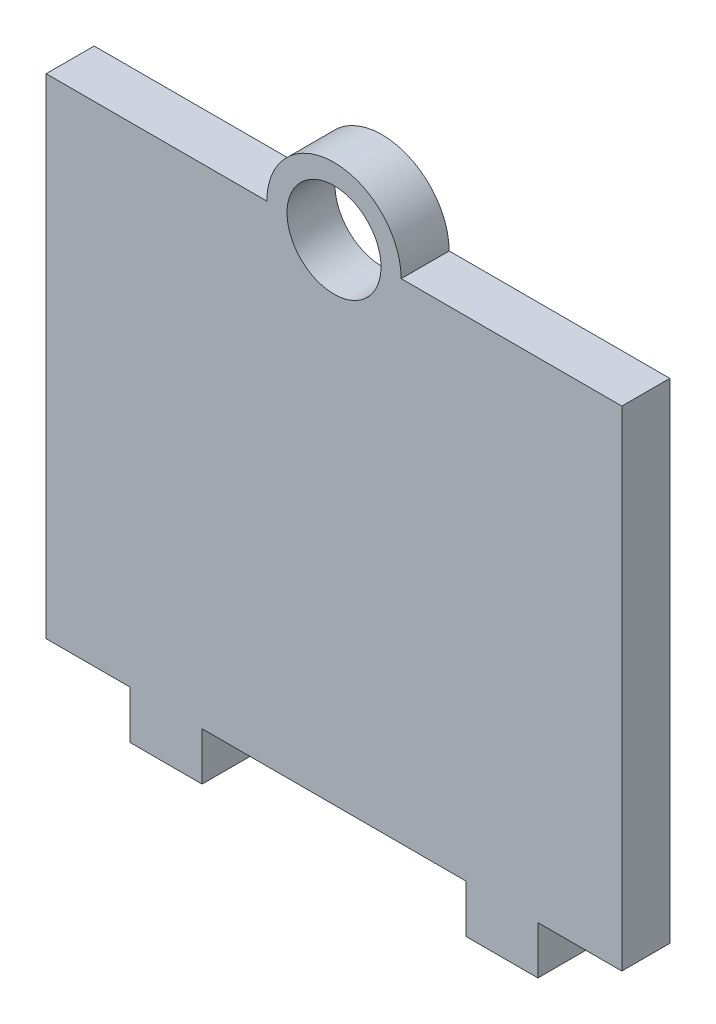
ISO-10303-21;
HEADER;
FILE_DESCRIPTION(('STEP AP214'),'2;1');
FILE_NAME('part.step','',(''),(''),'','','');
FILE_SCHEMA(('AUTOMOTIVE_DESIGN { 1 0 10303 214 1 1 1 1 }'));
ENDSEC;
DATA;
#1=APPLICATION_CONTEXT('core data for automotive mechanical design processes');
#2=APPLICATION_PROTOCOL_DEFINITION('international standard','automotive_design',2000,#1);
#3=PRODUCT_CONTEXT('',#1,'mechanical');
#4=PRODUCT('Part','Part','',(#3));
#5=PRODUCT_RELATED_PRODUCT_CATEGORY('part','',(#4));
#6=PRODUCT_DEFINITION_FORMATION('','',#4);
#7=PRODUCT_DEFINITION_CONTEXT('part definition',#1,'design');
#8=PRODUCT_DEFINITION('design','',#6,#7);
#9=PRODUCT_DEFINITION_SHAPE('','',#8);
#10=(LENGTH_UNIT() NAMED_UNIT(*) SI_UNIT(.MILLI.,.METRE.));
#11=(NAMED_UNIT(*) PLANE_ANGLE_UNIT() SI_UNIT($,.RADIAN.));
#12=(NAMED_UNIT(*) SI_UNIT($,.STERADIAN.) SOLID_ANGLE_UNIT());
#13=UNCERTAINTY_MEASURE_WITH_UNIT(LENGTH_MEASURE(1.E-05),#10,'distance_accuracy_value','');
#14=(GEOMETRIC_REPRESENTATION_CONTEXT(3) GLOBAL_UNCERTAINTY_ASSIGNED_CONTEXT((#13)) GLOBAL_UNIT_ASSIGNED_CONTEXT((#10,
#11,#12)) REPRESENTATION_CONTEXT('',''));
#15=CARTESIAN_POINT('',(0.,0.,0.));
#16=DIRECTION('',(0.,0.,1.));
#17=DIRECTION('',(1.,0.,0.));
#18=AXIS2_PLACEMENT_3D('',#15,#16,#17);
#19=CARTESIAN_POINT('',(-76.2,142.24,-12.7));
#20=DIRECTION('',(-1.,0.,0.));
#21=DIRECTION('',(0.,0.,1.));
#22=AXIS2_PLACEMENT_3D('',#19,#20,#21);
#23=PLANE('',#22);
#24=DIRECTION('',(0.,-1.,0.));
#25=VECTOR('',#24,1.);
#26=CARTESIAN_POINT('',(-76.2,142.24,0.));
#27=LINE('',#26,#25);
#28=CARTESIAN_POINT('',(-76.2,142.24,0.));
#29=VERTEX_POINT('',#28);
#30=CARTESIAN_POINT('',(-76.2,12.7,0.));
#31=VERTEX_POINT('',#30);
#32=EDGE_CURVE('E164',#29,#31,#27,.T.);
#33=ORIENTED_EDGE('',*,*,#32,.F.);
#34=DIRECTION('',(0.,0.,1.));
#35=VECTOR('',#34,1.);
#36=CARTESIAN_POINT('',(-76.2,142.24,-12.7));
#37=LINE('',#36,#35);
#38=CARTESIAN_POINT('',(-76.2,142.24,-12.7));
#39=VERTEX_POINT('',#38);
#40=EDGE_CURVE('E11',#39,#29,#37,.T.);
#41=ORIENTED_EDGE('',*,*,#40,.F.);
#42=DIRECTION('',(0.,-1.,0.));
#43=VECTOR('',#42,1.);
#44=CARTESIAN_POINT('',(-76.2,142.24,-12.7));
#45=LINE('',#44,#43);
#46=CARTESIAN_POINT('',(-76.2,12.7,-12.7));
#47=VERTEX_POINT('',#46);
#48=EDGE_CURVE('E203',#39,#47,#45,.T.);
#49=ORIENTED_EDGE('',*,*,#48,.T.);
#50=DIRECTION('',(0.,0.,1.));
#51=VECTOR('',#50,1.);
#52=CARTESIAN_POINT('',(-76.2,12.7,-12.7));
#53=LINE('',#52,#51);
#54=EDGE_CURVE('E34',#47,#31,#53,.T.);
#55=ORIENTED_EDGE('',*,*,#54,.T.);
#56=EDGE_LOOP('',(#33,#41,#49,#55));
#57=FACE_BOUND('',#56,.T.);
#58=ADVANCED_FACE('F31',(#57),#23,.T.);
#59=CARTESIAN_POINT('',(-76.2,142.24,-12.7));
#60=DIRECTION('',(0.,1.,0.));
#61=DIRECTION('',(0.,0.,1.));
#62=AXIS2_PLACEMENT_3D('',#59,#60,#61);
#63=PLANE('',#62);
#64=DIRECTION('',(-1.,0.,0.));
#65=VECTOR('',#64,1.);
#66=CARTESIAN_POINT('',(-76.2,142.24,0.));
#67=LINE('',#66,#65);
#68=CARTESIAN_POINT('',(-17.78,142.24,0.));
#69=VERTEX_POINT('',#68);
#70=EDGE_CURVE('E201',#69,#29,#67,.T.);
#71=ORIENTED_EDGE('',*,*,#70,.F.);
#72=DIRECTION('',(0.,0.,1.));
#73=VECTOR('',#72,1.);
#74=CARTESIAN_POINT('',(-17.78,142.24,-12.7));
#75=LINE('',#74,#73);
#76=CARTESIAN_POINT('',(-17.78,142.24,-12.7));
#77=VERTEX_POINT('',#76);
#78=EDGE_CURVE('E40',#77,#69,#75,.T.);
#79=ORIENTED_EDGE('',*,*,#78,.F.);
#80=DIRECTION('',(-1.,0.,0.));
#81=VECTOR('',#80,1.);
#82=CARTESIAN_POINT('',(-76.2,142.24,-12.7));
#83=LINE('',#82,#81);
#84=EDGE_CURVE('E154',#77,#39,#83,.T.);
#85=ORIENTED_EDGE('',*,*,#84,.T.);
#86=ORIENTED_EDGE('',*,*,#40,.T.);
#87=EDGE_LOOP('',(#71,#79,#85,#86));
#88=FACE_BOUND('',#87,.T.);
#89=ADVANCED_FACE('F227',(#88),#63,.T.);
#90=CARTESIAN_POINT('',(0.,142.24,-12.7));
#91=DIRECTION('',(0.,0.,1.));
#92=DIRECTION('',(1.,0.,0.));
#93=AXIS2_PLACEMENT_3D('',#90,#91,#92);
#94=CYLINDRICAL_SURFACE('',#93,17.78);
#95=CARTESIAN_POINT('',(0.,142.24,0.));
#96=DIRECTION('',(0.,0.,1.));
#97=DIRECTION('',(1.,0.,0.));
#98=AXIS2_PLACEMENT_3D('',#95,#96,#97);
#99=CIRCLE('',#98,17.78);
#100=CARTESIAN_POINT('',(17.78,142.24,0.));
#101=VERTEX_POINT('',#100);
#102=EDGE_CURVE('E141',#101,#69,#99,.T.);
#103=ORIENTED_EDGE('',*,*,#102,.F.);
#104=DIRECTION('',(0.,0.,1.));
#105=VECTOR('',#104,1.);
#106=CARTESIAN_POINT('',(17.78,142.24,-12.7));
#107=LINE('',#106,#105);
#108=CARTESIAN_POINT('',(17.78,142.24,-12.7));
#109=VERTEX_POINT('',#108);
#110=EDGE_CURVE('E136',#109,#101,#107,.T.);
#111=ORIENTED_EDGE('',*,*,#110,.F.);
#112=CARTESIAN_POINT('',(0.,142.24,-12.7));
#113=DIRECTION('',(0.,0.,1.));
#114=DIRECTION('',(1.,0.,0.));
#115=AXIS2_PLACEMENT_3D('',#112,#113,#114);
#116=CIRCLE('',#115,17.78);
#117=EDGE_CURVE('E139',#109,#77,#116,.T.);
#118=ORIENTED_EDGE('',*,*,#117,.T.);
#119=ORIENTED_EDGE('',*,*,#78,.T.);
#120=EDGE_LOOP('',(#103,#111,#118,#119));
#121=FACE_BOUND('',#120,.T.);
#122=ADVANCED_FACE('F138',(#121),#94,.T.);
#123=CARTESIAN_POINT('',(17.78,142.24,-12.7));
#124=DIRECTION('',(0.,1.,0.));
#125=DIRECTION('',(0.,0.,1.));
#126=AXIS2_PLACEMENT_3D('',#123,#124,#125);
#127=PLANE('',#126);
#128=DIRECTION('',(-1.,0.,0.));
#129=VECTOR('',#128,1.);
#130=CARTESIAN_POINT('',(17.78,142.24,0.));
#131=LINE('',#130,#129);
#132=CARTESIAN_POINT('',(76.2,142.24,0.));
#133=VERTEX_POINT('',#132);
#134=EDGE_CURVE('E198',#133,#101,#131,.T.);
#135=ORIENTED_EDGE('',*,*,#134,.F.);
#136=DIRECTION('',(0.,0.,1.));
#137=VECTOR('',#136,1.);
#138=CARTESIAN_POINT('',(76.2,142.24,-12.7));
#139=LINE('',#138,#137);
#140=CARTESIAN_POINT('',(76.2,142.24,-12.7));
#141=VERTEX_POINT('',#140);
#142=EDGE_CURVE('E146',#141,#133,#139,.T.);
#143=ORIENTED_EDGE('',*,*,#142,.F.);
#144=DIRECTION('',(-1.,0.,0.));
#145=VECTOR('',#144,1.);
#146=CARTESIAN_POINT('',(17.78,142.24,-12.7));
#147=LINE('',#146,#145);
#148=EDGE_CURVE('E152',#141,#109,#147,.T.);
#149=ORIENTED_EDGE('',*,*,#148,.T.);
#150=ORIENTED_EDGE('',*,*,#110,.T.);
#151=EDGE_LOOP('',(#135,#143,#149,#150));
#152=FACE_BOUND('',#151,.T.);
#153=ADVANCED_FACE('F156',(#152),#127,.T.);
#154=CARTESIAN_POINT('',(76.2,142.24,-12.7));
#155=DIRECTION('',(1.,0.,0.));
#156=DIRECTION('',(0.,1.,0.));
#157=AXIS2_PLACEMENT_3D('',#154,#155,#156);
#158=PLANE('',#157);
#159=DIRECTION('',(0.,1.,0.));
#160=VECTOR('',#159,1.);
#161=CARTESIAN_POINT('',(76.2,142.24,0.));
#162=LINE('',#161,#160);
#163=CARTESIAN_POINT('',(76.2,12.7,0.));
#164=VERTEX_POINT('',#163);
#165=EDGE_CURVE('E195',#164,#133,#162,.T.);
#166=ORIENTED_EDGE('',*,*,#165,.F.);
#167=DIRECTION('',(0.,0.,1.));
#168=VECTOR('',#167,1.);
#169=CARTESIAN_POINT('',(76.2,12.7,-12.7));
#170=LINE('',#169,#168);
#171=CARTESIAN_POINT('',(76.2,12.7,-12.7));
#172=VERTEX_POINT('',#171);
#173=EDGE_CURVE('E207',#172,#164,#170,.T.);
#174=ORIENTED_EDGE('',*,*,#173,.F.);
#175=DIRECTION('',(0.,1.,0.));
#176=VECTOR('',#175,1.);
#177=CARTESIAN_POINT('',(76.2,142.24,-12.7));
#178=LINE('',#177,#176);
#179=EDGE_CURVE('E157',#172,#141,#178,.T.);
#180=ORIENTED_EDGE('',*,*,#179,.T.);
#181=ORIENTED_EDGE('',*,*,#142,.T.);
#182=EDGE_LOOP('',(#166,#174,#180,#181));
#183=FACE_BOUND('',#182,.T.);
#184=ADVANCED_FACE('F240',(#183),#158,.T.);
#185=CARTESIAN_POINT('',(53.975,12.7,-12.7));
#186=DIRECTION('',(0.,-1.,0.));
#187=DIRECTION('',(0.,0.,-1.));
#188=AXIS2_PLACEMENT_3D('',#185,#186,#187);
#189=PLANE('',#188);
#190=DIRECTION('',(1.,0.,0.));
#191=VECTOR('',#190,1.);
#192=CARTESIAN_POINT('',(53.975,12.7,0.));
#193=LINE('',#192,#191);
#194=CARTESIAN_POINT('',(53.975,12.7,0.));
#195=VERTEX_POINT('',#194);
#196=EDGE_CURVE('E192',#195,#164,#193,.T.);
#197=ORIENTED_EDGE('',*,*,#196,.F.);
#198=DIRECTION('',(0.,0.,1.));
#199=VECTOR('',#198,1.);
#200=CARTESIAN_POINT('',(53.975,12.7,-12.7));
#201=LINE('',#200,#199);
#202=CARTESIAN_POINT('',(53.975,12.7,-12.7));
#203=VERTEX_POINT('',#202);
#204=EDGE_CURVE('E209',#203,#195,#201,.T.);
#205=ORIENTED_EDGE('',*,*,#204,.F.);
#206=DIRECTION('',(1.,0.,0.));
#207=VECTOR('',#206,1.);
#208=CARTESIAN_POINT('',(53.975,12.7,-12.7));
#209=LINE('',#208,#207);
#210=EDGE_CURVE('E159',#203,#172,#209,.T.);
#211=ORIENTED_EDGE('',*,*,#210,.T.);
#212=ORIENTED_EDGE('',*,*,#173,.T.);
#213=EDGE_LOOP('',(#197,#205,#211,#212));
#214=FACE_BOUND('',#213,.T.);
#215=ADVANCED_FACE('F243',(#214),#189,.T.);
#216=CARTESIAN_POINT('',(53.975,0.,-12.7));
#217=DIRECTION('',(1.,0.,0.));
#218=DIRECTION('',(0.,0.,-1.));
#219=AXIS2_PLACEMENT_3D('',#216,#217,#218);
#220=PLANE('',#219);
#221=DIRECTION('',(0.,1.,0.));
#222=VECTOR('',#221,1.);
#223=CARTESIAN_POINT('',(53.975,0.,0.));
#224=LINE('',#223,#222);
#225=CARTESIAN_POINT('',(53.975,0.,0.));
#226=VERTEX_POINT('',#225);
#227=EDGE_CURVE('E189',#226,#195,#224,.T.);
#228=ORIENTED_EDGE('',*,*,#227,.F.);
#229=DIRECTION('',(0.,0.,1.));
#230=VECTOR('',#229,1.);
#231=CARTESIAN_POINT('',(53.975,0.,-12.7));
#232=LINE('',#231,#230);
#233=CARTESIAN_POINT('',(53.975,0.,-12.7));
#234=VERTEX_POINT('',#233);
#235=EDGE_CURVE('E211',#234,#226,#232,.T.);
#236=ORIENTED_EDGE('',*,*,#235,.F.);
#237=DIRECTION('',(0.,1.,0.));
#238=VECTOR('',#237,1.);
#239=CARTESIAN_POINT('',(53.975,0.,-12.7));
#240=LINE('',#239,#238);
#241=EDGE_CURVE('E320',#234,#203,#240,.T.);
#242=ORIENTED_EDGE('',*,*,#241,.T.);
#243=ORIENTED_EDGE('',*,*,#204,.T.);
#244=EDGE_LOOP('',(#228,#236,#242,#243));
#245=FACE_BOUND('',#244,.T.);
#246=ADVANCED_FACE('F247',(#245),#220,.T.);
#247=CARTESIAN_POINT('',(53.975,0.,-12.7));
#248=DIRECTION('',(0.,-1.,0.));
#249=DIRECTION('',(0.,0.,-1.));
#250=AXIS2_PLACEMENT_3D('',#247,#248,#249);
#251=PLANE('',#250);
#252=DIRECTION('',(1.,0.,0.));
#253=VECTOR('',#252,1.);
#254=CARTESIAN_POINT('',(53.975,0.,0.));
#255=LINE('',#254,#253);
#256=CARTESIAN_POINT('',(34.925,0.,0.));
#257=VERTEX_POINT('',#256);
#258=EDGE_CURVE('E186',#257,#226,#255,.T.);
#259=ORIENTED_EDGE('',*,*,#258,.F.);
#260=DIRECTION('',(0.,0.,1.));
#261=VECTOR('',#260,1.);
#262=CARTESIAN_POINT('',(34.925,0.,-12.7));
#263=LINE('',#262,#261);
#264=CARTESIAN_POINT('',(34.925,0.,-12.7));
#265=VERTEX_POINT('',#264);
#266=EDGE_CURVE('E213',#265,#257,#263,.T.);
#267=ORIENTED_EDGE('',*,*,#266,.F.);
#268=DIRECTION('',(1.,0.,0.));
#269=VECTOR('',#268,1.);
#270=CARTESIAN_POINT('',(53.975,0.,-12.7));
#271=LINE('',#270,#269);
#272=EDGE_CURVE('E317',#265,#234,#271,.T.);
#273=ORIENTED_EDGE('',*,*,#272,.T.);
#274=ORIENTED_EDGE('',*,*,#235,.T.);
#275=EDGE_LOOP('',(#259,#267,#273,#274));
#276=FACE_BOUND('',#275,.T.);
#277=ADVANCED_FACE('F251',(#276),#251,.T.);
#278=CARTESIAN_POINT('',(34.925,0.,-12.7));
#279=DIRECTION('',(-1.,0.,0.));
#280=DIRECTION('',(0.,0.,1.));
#281=AXIS2_PLACEMENT_3D('',#278,#279,#280);
#282=PLANE('',#281);
#283=DIRECTION('',(0.,-1.,0.));
#284=VECTOR('',#283,1.);
#285=CARTESIAN_POINT('',(34.925,0.,0.));
#286=LINE('',#285,#284);
#287=CARTESIAN_POINT('',(34.925,12.7,0.));
#288=VERTEX_POINT('',#287);
#289=EDGE_CURVE('E183',#288,#257,#286,.T.);
#290=ORIENTED_EDGE('',*,*,#289,.F.);
#291=DIRECTION('',(0.,0.,1.));
#292=VECTOR('',#291,1.);
#293=CARTESIAN_POINT('',(34.925,12.7,-12.7));
#294=LINE('',#293,#292);
#295=CARTESIAN_POINT('',(34.925,12.7,-12.7));
#296=VERTEX_POINT('',#295);
#297=EDGE_CURVE('E215',#296,#288,#294,.T.);
#298=ORIENTED_EDGE('',*,*,#297,.F.);
#299=DIRECTION('',(0.,-1.,0.));
#300=VECTOR('',#299,1.);
#301=CARTESIAN_POINT('',(34.925,0.,-12.7));
#302=LINE('',#301,#300);
#303=EDGE_CURVE('E314',#296,#265,#302,.T.);
#304=ORIENTED_EDGE('',*,*,#303,.T.);
#305=ORIENTED_EDGE('',*,*,#266,.T.);
#306=EDGE_LOOP('',(#290,#298,#304,#305));
#307=FACE_BOUND('',#306,.T.);
#308=ADVANCED_FACE('F255',(#307),#282,.T.);
#309=CARTESIAN_POINT('',(-34.925,12.7,-12.7));
#310=DIRECTION('',(0.,-1.,0.));
#311=DIRECTION('',(0.,0.,-1.));
#312=AXIS2_PLACEMENT_3D('',#309,#310,#311);
#313=PLANE('',#312);
#314=DIRECTION('',(1.,0.,0.));
#315=VECTOR('',#314,1.);
#316=CARTESIAN_POINT('',(-34.925,12.7,0.));
#317=LINE('',#316,#315);
#318=CARTESIAN_POINT('',(-34.925,12.7,0.));
#319=VERTEX_POINT('',#318);
#320=EDGE_CURVE('E180',#319,#288,#317,.T.);
#321=ORIENTED_EDGE('',*,*,#320,.F.);
#322=DIRECTION('',(0.,0.,1.));
#323=VECTOR('',#322,1.);
#324=CARTESIAN_POINT('',(-34.925,12.7,-12.7));
#325=LINE('',#324,#323);
#326=CARTESIAN_POINT('',(-34.925,12.7,-12.7));
#327=VERTEX_POINT('',#326);
#328=EDGE_CURVE('E217',#327,#319,#325,.T.);
#329=ORIENTED_EDGE('',*,*,#328,.F.);
#330=DIRECTION('',(1.,0.,0.));
#331=VECTOR('',#330,1.);
#332=CARTESIAN_POINT('',(-34.925,12.7,-12.7));
#333=LINE('',#332,#331);
#334=EDGE_CURVE('E311',#327,#296,#333,.T.);
#335=ORIENTED_EDGE('',*,*,#334,.T.);
#336=ORIENTED_EDGE('',*,*,#297,.T.);
#337=EDGE_LOOP('',(#321,#329,#335,#336));
#338=FACE_BOUND('',#337,.T.);
#339=ADVANCED_FACE('F259',(#338),#313,.T.);
#340=CARTESIAN_POINT('',(-34.925,0.,-12.7));
#341=DIRECTION('',(1.,0.,0.));
#342=DIRECTION('',(0.,0.,-1.));
#343=AXIS2_PLACEMENT_3D('',#340,#341,#342);
#344=PLANE('',#343);
#345=DIRECTION('',(0.,1.,0.));
#346=VECTOR('',#345,1.);
#347=CARTESIAN_POINT('',(-34.925,0.,0.));
#348=LINE('',#347,#346);
#349=CARTESIAN_POINT('',(-34.925,0.,0.));
#350=VERTEX_POINT('',#349);
#351=EDGE_CURVE('E177',#350,#319,#348,.T.);
#352=ORIENTED_EDGE('',*,*,#351,.F.);
#353=DIRECTION('',(0.,0.,1.));
#354=VECTOR('',#353,1.);
#355=CARTESIAN_POINT('',(-34.925,0.,-12.7));
#356=LINE('',#355,#354);
#357=CARTESIAN_POINT('',(-34.925,0.,-12.7));
#358=VERTEX_POINT('',#357);
#359=EDGE_CURVE('E219',#358,#350,#356,.T.);
#360=ORIENTED_EDGE('',*,*,#359,.F.);
#361=DIRECTION('',(0.,1.,0.));
#362=VECTOR('',#361,1.);
#363=CARTESIAN_POINT('',(-34.925,0.,-12.7));
#364=LINE('',#363,#362);
#365=EDGE_CURVE('E308',#358,#327,#364,.T.);
#366=ORIENTED_EDGE('',*,*,#365,.T.);
#367=ORIENTED_EDGE('',*,*,#328,.T.);
#368=EDGE_LOOP('',(#352,#360,#366,#367));
#369=FACE_BOUND('',#368,.T.);
#370=ADVANCED_FACE('F263',(#369),#344,.T.);
#371=CARTESIAN_POINT('',(-34.925,0.,-12.7));
#372=DIRECTION('',(0.,-1.,0.));
#373=DIRECTION('',(0.,0.,-1.));
#374=AXIS2_PLACEMENT_3D('',#371,#372,#373);
#375=PLANE('',#374);
#376=DIRECTION('',(1.,0.,0.));
#377=VECTOR('',#376,1.);
#378=CARTESIAN_POINT('',(-34.925,0.,0.));
#379=LINE('',#378,#377);
#380=CARTESIAN_POINT('',(-53.975,0.,0.));
#381=VERTEX_POINT('',#380);
#382=EDGE_CURVE('E174',#381,#350,#379,.T.);
#383=ORIENTED_EDGE('',*,*,#382,.F.);
#384=DIRECTION('',(0.,0.,1.));
#385=VECTOR('',#384,1.);
#386=CARTESIAN_POINT('',(-53.975,0.,-12.7));
#387=LINE('',#386,#385);
#388=CARTESIAN_POINT('',(-53.975,0.,-12.7));
#389=VERTEX_POINT('',#388);
#390=EDGE_CURVE('E221',#389,#381,#387,.T.);
#391=ORIENTED_EDGE('',*,*,#390,.F.);
#392=DIRECTION('',(1.,0.,0.));
#393=VECTOR('',#392,1.);
#394=CARTESIAN_POINT('',(-34.925,0.,-12.7));
#395=LINE('',#394,#393);
#396=EDGE_CURVE('E305',#389,#358,#395,.T.);
#397=ORIENTED_EDGE('',*,*,#396,.T.);
#398=ORIENTED_EDGE('',*,*,#359,.T.);
#399=EDGE_LOOP('',(#383,#391,#397,#398));
#400=FACE_BOUND('',#399,.T.);
#401=ADVANCED_FACE('F267',(#400),#375,.T.);
#402=CARTESIAN_POINT('',(-53.975,0.,-12.7));
#403=DIRECTION('',(-1.,0.,0.));
#404=DIRECTION('',(0.,0.,1.));
#405=AXIS2_PLACEMENT_3D('',#402,#403,#404);
#406=PLANE('',#405);
#407=DIRECTION('',(0.,-1.,0.));
#408=VECTOR('',#407,1.);
#409=CARTESIAN_POINT('',(-53.975,0.,0.));
#410=LINE('',#409,#408);
#411=CARTESIAN_POINT('',(-53.975,12.7,0.));
#412=VERTEX_POINT('',#411);
#413=EDGE_CURVE('E171',#412,#381,#410,.T.);
#414=ORIENTED_EDGE('',*,*,#413,.F.);
#415=DIRECTION('',(0.,0.,1.));
#416=VECTOR('',#415,1.);
#417=CARTESIAN_POINT('',(-53.975,12.7,-12.7));
#418=LINE('',#417,#416);
#419=CARTESIAN_POINT('',(-53.975,12.7,-12.7));
#420=VERTEX_POINT('',#419);
#421=EDGE_CURVE('E222',#420,#412,#418,.T.);
#422=ORIENTED_EDGE('',*,*,#421,.F.);
#423=DIRECTION('',(0.,-1.,0.));
#424=VECTOR('',#423,1.);
#425=CARTESIAN_POINT('',(-53.975,0.,-12.7));
#426=LINE('',#425,#424);
#427=EDGE_CURVE('E302',#420,#389,#426,.T.);
#428=ORIENTED_EDGE('',*,*,#427,.T.);
#429=ORIENTED_EDGE('',*,*,#390,.T.);
#430=EDGE_LOOP('',(#414,#422,#428,#429));
#431=FACE_BOUND('',#430,.T.);
#432=ADVANCED_FACE('F271',(#431),#406,.T.);
#433=CARTESIAN_POINT('',(-76.2,12.7,-12.7));
#434=DIRECTION('',(0.,-1.,0.));
#435=DIRECTION('',(0.,0.,-1.));
#436=AXIS2_PLACEMENT_3D('',#433,#434,#435);
#437=PLANE('',#436);
#438=DIRECTION('',(1.,0.,0.));
#439=VECTOR('',#438,1.);
#440=CARTESIAN_POINT('',(-76.2,12.7,0.));
#441=LINE('',#440,#439);
#442=EDGE_CURVE('E167',#31,#412,#441,.T.);
#443=ORIENTED_EDGE('',*,*,#442,.F.);
#444=ORIENTED_EDGE('',*,*,#54,.F.);
#445=DIRECTION('',(1.,0.,0.));
#446=VECTOR('',#445,1.);
#447=CARTESIAN_POINT('',(-76.2,12.7,-12.7));
#448=LINE('',#447,#446);
#449=EDGE_CURVE('E300',#47,#420,#448,.T.);
#450=ORIENTED_EDGE('',*,*,#449,.T.);
#451=ORIENTED_EDGE('',*,*,#421,.T.);
#452=EDGE_LOOP('',(#443,#444,#450,#451));
#453=FACE_BOUND('',#452,.T.);
#454=ADVANCED_FACE('F224',(#453),#437,.T.);
#455=CARTESIAN_POINT('',(0.,142.24,-12.7));
#456=DIRECTION('',(0.,0.,1.));
#457=DIRECTION('',(1.,0.,0.));
#458=AXIS2_PLACEMENT_3D('',#455,#456,#457);
#459=PLANE('',#458);
#460=CARTESIAN_POINT('',(0.,142.24,-12.7));
#461=DIRECTION('',(0.,0.,1.));
#462=DIRECTION('',(1.,0.,0.));
#463=AXIS2_PLACEMENT_3D('',#460,#461,#462);
#464=CIRCLE('',#463,12.446);
#465=CARTESIAN_POINT('',(12.446,142.24,-12.7));
#466=VERTEX_POINT('',#465);
#467=EDGE_CURVE('E168',#466,#466,#464,.T.);
#468=ORIENTED_EDGE('',*,*,#467,.T.);
#469=EDGE_LOOP('',(#468));
#470=FACE_BOUND('',#469,.T.);
#471=ORIENTED_EDGE('',*,*,#48,.F.);
#472=ORIENTED_EDGE('',*,*,#84,.F.);
#473=ORIENTED_EDGE('',*,*,#117,.F.);
#474=ORIENTED_EDGE('',*,*,#148,.F.);
#475=ORIENTED_EDGE('',*,*,#179,.F.);
#476=ORIENTED_EDGE('',*,*,#210,.F.);
#477=ORIENTED_EDGE('',*,*,#241,.F.);
#478=ORIENTED_EDGE('',*,*,#272,.F.);
#479=ORIENTED_EDGE('',*,*,#303,.F.);
#480=ORIENTED_EDGE('',*,*,#334,.F.);
#481=ORIENTED_EDGE('',*,*,#365,.F.);
#482=ORIENTED_EDGE('',*,*,#396,.F.);
#483=ORIENTED_EDGE('',*,*,#427,.F.);
#484=ORIENTED_EDGE('',*,*,#449,.F.);
#485=EDGE_LOOP('',(#471,#472,#473,#474,#475,#476,#477,#478,#479,#480,#481,#482,#483,#484));
#486=FACE_BOUND('',#485,.T.);
#487=ADVANCED_FACE('F150',(#470,#486),#459,.F.);
#488=CARTESIAN_POINT('',(0.,142.24,0.));
#489=DIRECTION('',(0.,0.,1.));
#490=DIRECTION('',(1.,0.,0.));
#491=AXIS2_PLACEMENT_3D('',#488,#489,#490);
#492=PLANE('',#491);
#493=CARTESIAN_POINT('',(0.,142.24,0.));
#494=DIRECTION('',(0.,0.,1.));
#495=DIRECTION('',(1.,0.,0.));
#496=AXIS2_PLACEMENT_3D('',#493,#494,#495);
#497=CIRCLE('',#496,12.446);
#498=CARTESIAN_POINT('',(12.446,142.24,0.));
#499=VERTEX_POINT('',#498);
#500=EDGE_CURVE('E295',#499,#499,#497,.T.);
#501=ORIENTED_EDGE('',*,*,#500,.F.);
#502=EDGE_LOOP('',(#501));
#503=FACE_BOUND('',#502,.T.);
#504=ORIENTED_EDGE('',*,*,#32,.T.);
#505=ORIENTED_EDGE('',*,*,#442,.T.);
#506=ORIENTED_EDGE('',*,*,#413,.T.);
#507=ORIENTED_EDGE('',*,*,#382,.T.);
#508=ORIENTED_EDGE('',*,*,#351,.T.);
#509=ORIENTED_EDGE('',*,*,#320,.T.);
#510=ORIENTED_EDGE('',*,*,#289,.T.);
#511=ORIENTED_EDGE('',*,*,#258,.T.);
#512=ORIENTED_EDGE('',*,*,#227,.T.);
#513=ORIENTED_EDGE('',*,*,#196,.T.);
#514=ORIENTED_EDGE('',*,*,#165,.T.);
#515=ORIENTED_EDGE('',*,*,#134,.T.);
#516=ORIENTED_EDGE('',*,*,#102,.T.);
#517=ORIENTED_EDGE('',*,*,#70,.T.);
#518=EDGE_LOOP('',(#504,#505,#506,#507,#508,#509,#510,#511,#512,#513,#514,#515,#516,#517));
#519=FACE_BOUND('',#518,.T.);
#520=ADVANCED_FACE('F226',(#503,#519),#492,.T.);
#521=CARTESIAN_POINT('',(0.,142.24,-12.7));
#522=DIRECTION('',(0.,0.,1.));
#523=DIRECTION('',(1.,0.,0.));
#524=AXIS2_PLACEMENT_3D('',#521,#522,#523);
#525=CYLINDRICAL_SURFACE('',#524,12.446);
#526=ORIENTED_EDGE('',*,*,#467,.F.);
#527=EDGE_LOOP('',(#526));
#528=FACE_BOUND('',#527,.T.);
#529=ORIENTED_EDGE('',*,*,#500,.T.);
#530=EDGE_LOOP('',(#529));
#531=FACE_BOUND('',#530,.T.);
#532=ADVANCED_FACE('F283',(#528,#531),#525,.F.);
#533=CLOSED_SHELL('',(#58,#89,#122,#153,#184,#215,#246,#277,#308,#339,#370,#401,#432,#454,#487,
#520,#532));
#534=MANIFOLD_SOLID_BREP('B2',#533);
#535=ADVANCED_BREP_SHAPE_REPRESENTATION('',(#18,#534),#14);
#536=SHAPE_DEFINITION_REPRESENTATION(#9,#535);
ENDSEC;
END-ISO-10303-21;
